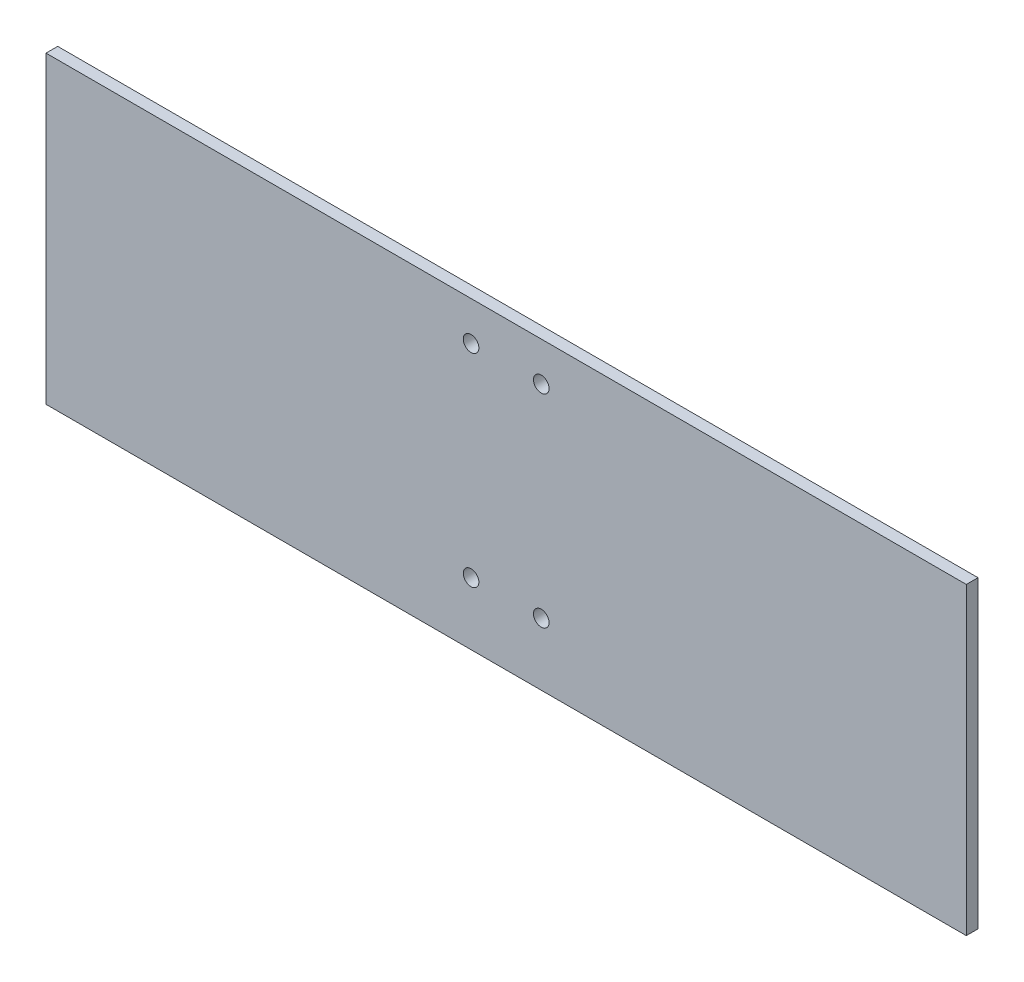
ISO-10303-21;
HEADER;
FILE_DESCRIPTION(('STEP AP214'),'2;1');
FILE_NAME('part.step','',(''),(''),'','','');
FILE_SCHEMA(('AUTOMOTIVE_DESIGN { 1 0 10303 214 1 1 1 1 }'));
ENDSEC;
DATA;
#1=APPLICATION_CONTEXT('core data for automotive mechanical design processes');
#2=APPLICATION_PROTOCOL_DEFINITION('international standard','automotive_design',2000,#1);
#3=PRODUCT_CONTEXT('',#1,'mechanical');
#4=PRODUCT('Part','Part','',(#3));
#5=PRODUCT_RELATED_PRODUCT_CATEGORY('part','',(#4));
#6=PRODUCT_DEFINITION_FORMATION('','',#4);
#7=PRODUCT_DEFINITION_CONTEXT('part definition',#1,'design');
#8=PRODUCT_DEFINITION('design','',#6,#7);
#9=PRODUCT_DEFINITION_SHAPE('','',#8);
#10=(LENGTH_UNIT() NAMED_UNIT(*) SI_UNIT(.MILLI.,.METRE.));
#11=(NAMED_UNIT(*) PLANE_ANGLE_UNIT() SI_UNIT($,.RADIAN.));
#12=(NAMED_UNIT(*) SI_UNIT($,.STERADIAN.) SOLID_ANGLE_UNIT());
#13=UNCERTAINTY_MEASURE_WITH_UNIT(LENGTH_MEASURE(1.E-05),#10,'distance_accuracy_value','');
#14=(GEOMETRIC_REPRESENTATION_CONTEXT(3) GLOBAL_UNCERTAINTY_ASSIGNED_CONTEXT((#13)) GLOBAL_UNIT_ASSIGNED_CONTEXT((#10,
#11,#12)) REPRESENTATION_CONTEXT('',''));
#15=CARTESIAN_POINT('',(0.,0.,0.));
#16=DIRECTION('',(0.,0.,1.));
#17=DIRECTION('',(1.,0.,0.));
#18=AXIS2_PLACEMENT_3D('',#15,#16,#17);
#19=CARTESIAN_POINT('',(-118.,33.,3.));
#20=DIRECTION('',(1.,0.,0.));
#21=DIRECTION('',(0.,1.,0.));
#22=AXIS2_PLACEMENT_3D('',#19,#20,#21);
#23=PLANE('',#22);
#24=DIRECTION('',(0.,-1.,0.));
#25=VECTOR('',#24,1.);
#26=CARTESIAN_POINT('',(-118.,33.,0.));
#27=LINE('',#26,#25);
#28=CARTESIAN_POINT('',(-118.,33.,0.));
#29=VERTEX_POINT('',#28);
#30=CARTESIAN_POINT('',(-118.,-45.,0.));
#31=VERTEX_POINT('',#30);
#32=EDGE_CURVE('E123',#29,#31,#27,.T.);
#33=ORIENTED_EDGE('',*,*,#32,.T.);
#34=DIRECTION('',(0.,0.,1.));
#35=VECTOR('',#34,1.);
#36=CARTESIAN_POINT('',(-118.,-45.,0.));
#37=LINE('',#36,#35);
#38=CARTESIAN_POINT('',(-118.,-45.,3.));
#39=VERTEX_POINT('',#38);
#40=EDGE_CURVE('E93',#31,#39,#37,.T.);
#41=ORIENTED_EDGE('',*,*,#40,.T.);
#42=DIRECTION('',(0.,-1.,0.));
#43=VECTOR('',#42,1.);
#44=CARTESIAN_POINT('',(-118.,33.,3.));
#45=LINE('',#44,#43);
#46=CARTESIAN_POINT('',(-118.,33.,3.));
#47=VERTEX_POINT('',#46);
#48=EDGE_CURVE('E84',#47,#39,#45,.T.);
#49=ORIENTED_EDGE('',*,*,#48,.F.);
#50=DIRECTION('',(0.,0.,-1.));
#51=VECTOR('',#50,1.);
#52=CARTESIAN_POINT('',(-118.,33.,3.));
#53=LINE('',#52,#51);
#54=EDGE_CURVE('E46',#47,#29,#53,.T.);
#55=ORIENTED_EDGE('',*,*,#54,.T.);
#56=EDGE_LOOP('',(#33,#41,#49,#55));
#57=FACE_BOUND('',#56,.T.);
#58=ADVANCED_FACE('F38',(#57),#23,.F.);
#59=CARTESIAN_POINT('',(118.,33.,3.));
#60=DIRECTION('',(-1.,0.,0.));
#61=DIRECTION('',(0.,-1.,0.));
#62=AXIS2_PLACEMENT_3D('',#59,#60,#61);
#63=PLANE('',#62);
#64=DIRECTION('',(0.,1.,0.));
#65=VECTOR('',#64,1.);
#66=CARTESIAN_POINT('',(118.,33.,0.));
#67=LINE('',#66,#65);
#68=CARTESIAN_POINT('',(118.,-45.,0.));
#69=VERTEX_POINT('',#68);
#70=CARTESIAN_POINT('',(118.,33.,0.));
#71=VERTEX_POINT('',#70);
#72=EDGE_CURVE('E65',#69,#71,#67,.T.);
#73=ORIENTED_EDGE('',*,*,#72,.T.);
#74=DIRECTION('',(0.,0.,-1.));
#75=VECTOR('',#74,1.);
#76=CARTESIAN_POINT('',(118.,33.,3.));
#77=LINE('',#76,#75);
#78=CARTESIAN_POINT('',(118.,33.,3.));
#79=VERTEX_POINT('',#78);
#80=EDGE_CURVE('E11',#79,#71,#77,.T.);
#81=ORIENTED_EDGE('',*,*,#80,.F.);
#82=DIRECTION('',(0.,1.,0.));
#83=VECTOR('',#82,1.);
#84=CARTESIAN_POINT('',(118.,33.,3.));
#85=LINE('',#84,#83);
#86=CARTESIAN_POINT('',(118.,-45.,3.));
#87=VERTEX_POINT('',#86);
#88=EDGE_CURVE('E78',#87,#79,#85,.T.);
#89=ORIENTED_EDGE('',*,*,#88,.F.);
#90=DIRECTION('',(0.,0.,1.));
#91=VECTOR('',#90,1.);
#92=CARTESIAN_POINT('',(118.,-45.,0.));
#93=LINE('',#92,#91);
#94=EDGE_CURVE('E81',#69,#87,#93,.T.);
#95=ORIENTED_EDGE('',*,*,#94,.F.);
#96=EDGE_LOOP('',(#73,#81,#89,#95));
#97=FACE_BOUND('',#96,.T.);
#98=ADVANCED_FACE('F80',(#97),#63,.F.);
#99=CARTESIAN_POINT('',(-118.,33.,3.));
#100=DIRECTION('',(0.,-1.,0.));
#101=DIRECTION('',(0.,0.,-1.));
#102=AXIS2_PLACEMENT_3D('',#99,#100,#101);
#103=PLANE('',#102);
#104=DIRECTION('',(-1.,0.,0.));
#105=VECTOR('',#104,1.);
#106=CARTESIAN_POINT('',(-118.,33.,0.));
#107=LINE('',#106,#105);
#108=EDGE_CURVE('E126',#71,#29,#107,.T.);
#109=ORIENTED_EDGE('',*,*,#108,.T.);
#110=ORIENTED_EDGE('',*,*,#54,.F.);
#111=DIRECTION('',(-1.,0.,0.));
#112=VECTOR('',#111,1.);
#113=CARTESIAN_POINT('',(-118.,33.,3.));
#114=LINE('',#113,#112);
#115=EDGE_CURVE('E54',#79,#47,#114,.T.);
#116=ORIENTED_EDGE('',*,*,#115,.F.);
#117=ORIENTED_EDGE('',*,*,#80,.T.);
#118=EDGE_LOOP('',(#109,#110,#116,#117));
#119=FACE_BOUND('',#118,.T.);
#120=ADVANCED_FACE('F136',(#119),#103,.F.);
#121=CARTESIAN_POINT('',(0.,0.,3.));
#122=DIRECTION('',(0.,0.,-1.));
#123=DIRECTION('',(-1.,0.,0.));
#124=AXIS2_PLACEMENT_3D('',#121,#122,#123);
#125=PLANE('',#124);
#126=CARTESIAN_POINT('',(8.99999999999989,23.,3.));
#127=DIRECTION('',(0.,0.,1.));
#128=DIRECTION('',(-1.,0.,0.));
#129=AXIS2_PLACEMENT_3D('',#126,#127,#128);
#130=CIRCLE('',#129,2.);
#131=CARTESIAN_POINT('',(10.9999999999999,23.,3.));
#132=VERTEX_POINT('',#131);
#133=EDGE_CURVE('E115',#132,#132,#130,.T.);
#134=ORIENTED_EDGE('',*,*,#133,.F.);
#135=EDGE_LOOP('',(#134));
#136=FACE_BOUND('',#135,.T.);
#137=CARTESIAN_POINT('',(-9.00000000000006,23.,3.));
#138=DIRECTION('',(0.,0.,1.));
#139=DIRECTION('',(-1.,0.,0.));
#140=AXIS2_PLACEMENT_3D('',#137,#138,#139);
#141=CIRCLE('',#140,2.);
#142=CARTESIAN_POINT('',(-7.00000000000005,23.,3.));
#143=VERTEX_POINT('',#142);
#144=EDGE_CURVE('E109',#143,#143,#141,.T.);
#145=ORIENTED_EDGE('',*,*,#144,.F.);
#146=EDGE_LOOP('',(#145));
#147=FACE_BOUND('',#146,.T.);
#148=CARTESIAN_POINT('',(-9.,-29.,3.));
#149=DIRECTION('',(0.,0.,1.));
#150=DIRECTION('',(1.,0.,0.));
#151=AXIS2_PLACEMENT_3D('',#148,#149,#150);
#152=CIRCLE('',#151,2.);
#153=CARTESIAN_POINT('',(-7.,-29.,3.));
#154=VERTEX_POINT('',#153);
#155=EDGE_CURVE('E102',#154,#154,#152,.T.);
#156=ORIENTED_EDGE('',*,*,#155,.F.);
#157=EDGE_LOOP('',(#156));
#158=FACE_BOUND('',#157,.T.);
#159=CARTESIAN_POINT('',(9.,-29.,3.));
#160=DIRECTION('',(0.,0.,1.));
#161=DIRECTION('',(1.,0.,0.));
#162=AXIS2_PLACEMENT_3D('',#159,#160,#161);
#163=CIRCLE('',#162,2.);
#164=CARTESIAN_POINT('',(11.,-29.,3.));
#165=VERTEX_POINT('',#164);
#166=EDGE_CURVE('E120',#165,#165,#163,.T.);
#167=ORIENTED_EDGE('',*,*,#166,.F.);
#168=EDGE_LOOP('',(#167));
#169=FACE_BOUND('',#168,.T.);
#170=ORIENTED_EDGE('',*,*,#48,.T.);
#171=DIRECTION('',(1.,0.,0.));
#172=VECTOR('',#171,1.);
#173=CARTESIAN_POINT('',(-118.,-45.,3.));
#174=LINE('',#173,#172);
#175=EDGE_CURVE('E90',#39,#87,#174,.T.);
#176=ORIENTED_EDGE('',*,*,#175,.T.);
#177=ORIENTED_EDGE('',*,*,#88,.T.);
#178=ORIENTED_EDGE('',*,*,#115,.T.);
#179=EDGE_LOOP('',(#170,#176,#177,#178));
#180=FACE_BOUND('',#179,.T.);
#181=ADVANCED_FACE('F95',(#136,#147,#158,#169,#180),#125,.F.);
#182=CARTESIAN_POINT('',(0.,0.,0.));
#183=DIRECTION('',(0.,0.,-1.));
#184=DIRECTION('',(-1.,0.,0.));
#185=AXIS2_PLACEMENT_3D('',#182,#183,#184);
#186=PLANE('',#185);
#187=CARTESIAN_POINT('',(8.99999999999989,23.,0.));
#188=DIRECTION('',(0.,0.,-1.));
#189=DIRECTION('',(-1.,0.,0.));
#190=AXIS2_PLACEMENT_3D('',#187,#188,#189);
#191=CIRCLE('',#190,2.);
#192=CARTESIAN_POINT('',(10.9999999999999,23.,0.));
#193=VERTEX_POINT('',#192);
#194=EDGE_CURVE('E92',#193,#193,#191,.F.);
#195=ORIENTED_EDGE('',*,*,#194,.T.);
#196=EDGE_LOOP('',(#195));
#197=FACE_BOUND('',#196,.T.);
#198=CARTESIAN_POINT('',(-9.00000000000006,23.,0.));
#199=DIRECTION('',(0.,0.,-1.));
#200=DIRECTION('',(-1.,0.,0.));
#201=AXIS2_PLACEMENT_3D('',#198,#199,#200);
#202=CIRCLE('',#201,2.);
#203=CARTESIAN_POINT('',(-7.00000000000005,23.,0.));
#204=VERTEX_POINT('',#203);
#205=EDGE_CURVE('E112',#204,#204,#202,.F.);
#206=ORIENTED_EDGE('',*,*,#205,.T.);
#207=EDGE_LOOP('',(#206));
#208=FACE_BOUND('',#207,.T.);
#209=CARTESIAN_POINT('',(-9.,-29.,0.));
#210=DIRECTION('',(0.,0.,-1.));
#211=DIRECTION('',(-1.,0.,0.));
#212=AXIS2_PLACEMENT_3D('',#209,#210,#211);
#213=CIRCLE('',#212,2.);
#214=CARTESIAN_POINT('',(-7.,-29.,0.));
#215=VERTEX_POINT('',#214);
#216=EDGE_CURVE('E106',#215,#215,#213,.F.);
#217=ORIENTED_EDGE('',*,*,#216,.T.);
#218=EDGE_LOOP('',(#217));
#219=FACE_BOUND('',#218,.T.);
#220=CARTESIAN_POINT('',(9.,-29.,0.));
#221=DIRECTION('',(0.,0.,-1.));
#222=DIRECTION('',(-1.,0.,0.));
#223=AXIS2_PLACEMENT_3D('',#220,#221,#222);
#224=CIRCLE('',#223,2.);
#225=CARTESIAN_POINT('',(11.,-29.,0.));
#226=VERTEX_POINT('',#225);
#227=EDGE_CURVE('E105',#226,#226,#224,.F.);
#228=ORIENTED_EDGE('',*,*,#227,.T.);
#229=EDGE_LOOP('',(#228));
#230=FACE_BOUND('',#229,.T.);
#231=ORIENTED_EDGE('',*,*,#32,.F.);
#232=ORIENTED_EDGE('',*,*,#108,.F.);
#233=ORIENTED_EDGE('',*,*,#72,.F.);
#234=DIRECTION('',(1.,0.,0.));
#235=VECTOR('',#234,1.);
#236=CARTESIAN_POINT('',(-118.,-45.,0.));
#237=LINE('',#236,#235);
#238=EDGE_CURVE('E91',#31,#69,#237,.T.);
#239=ORIENTED_EDGE('',*,*,#238,.F.);
#240=EDGE_LOOP('',(#231,#232,#233,#239));
#241=FACE_BOUND('',#240,.T.);
#242=ADVANCED_FACE('F135',(#197,#208,#219,#230,#241),#186,.T.);
#243=CARTESIAN_POINT('',(9.,-29.,-0.00100000000000013));
#244=DIRECTION('',(0.,0.,1.));
#245=DIRECTION('',(1.,0.,0.));
#246=AXIS2_PLACEMENT_3D('',#243,#244,#245);
#247=CYLINDRICAL_SURFACE('',#246,2.);
#248=CARTESIAN_POINT('',(11.,-29.,0.));
#249=CARTESIAN_POINT('',(11.,-29.,0.03125));
#250=CARTESIAN_POINT('',(11.,-29.,0.0625));
#251=CARTESIAN_POINT('',(11.,-29.,0.125));
#252=CARTESIAN_POINT('',(11.,-29.,0.15625));
#253=CARTESIAN_POINT('',(11.,-29.,0.21875));
#254=CARTESIAN_POINT('',(11.,-29.,0.25));
#255=CARTESIAN_POINT('',(11.,-29.,0.3125));
#256=CARTESIAN_POINT('',(11.,-29.,0.34375));
#257=CARTESIAN_POINT('',(11.,-29.,0.40625));
#258=CARTESIAN_POINT('',(11.,-29.,0.4375));
#259=CARTESIAN_POINT('',(11.,-29.,0.5));
#260=CARTESIAN_POINT('',(11.,-29.,0.53125));
#261=CARTESIAN_POINT('',(11.,-29.,0.59375));
#262=CARTESIAN_POINT('',(11.,-29.,0.625));
#263=CARTESIAN_POINT('',(11.,-29.,0.6875));
#264=CARTESIAN_POINT('',(11.,-29.,0.71875));
#265=CARTESIAN_POINT('',(11.,-29.,0.78125));
#266=CARTESIAN_POINT('',(11.,-29.,0.8125));
#267=CARTESIAN_POINT('',(11.,-29.,0.875));
#268=CARTESIAN_POINT('',(11.,-29.,0.90625));
#269=CARTESIAN_POINT('',(11.,-29.,0.96875));
#270=CARTESIAN_POINT('',(11.,-29.,1.));
#271=CARTESIAN_POINT('',(11.,-29.,1.0625));
#272=CARTESIAN_POINT('',(11.,-29.,1.09375));
#273=CARTESIAN_POINT('',(11.,-29.,1.15625));
#274=CARTESIAN_POINT('',(11.,-29.,1.1875));
#275=CARTESIAN_POINT('',(11.,-29.,1.25));
#276=CARTESIAN_POINT('',(11.,-29.,1.28125));
#277=CARTESIAN_POINT('',(11.,-29.,1.34375));
#278=CARTESIAN_POINT('',(11.,-29.,1.375));
#279=CARTESIAN_POINT('',(11.,-29.,1.4375));
#280=CARTESIAN_POINT('',(11.,-29.,1.46875));
#281=CARTESIAN_POINT('',(11.,-29.,1.53125));
#282=CARTESIAN_POINT('',(11.,-29.,1.5625));
#283=CARTESIAN_POINT('',(11.,-29.,1.625));
#284=CARTESIAN_POINT('',(11.,-29.,1.65625));
#285=CARTESIAN_POINT('',(11.,-29.,1.71875));
#286=CARTESIAN_POINT('',(11.,-29.,1.75));
#287=CARTESIAN_POINT('',(11.,-29.,1.8125));
#288=CARTESIAN_POINT('',(11.,-29.,1.84375));
#289=CARTESIAN_POINT('',(11.,-29.,1.90625));
#290=CARTESIAN_POINT('',(11.,-29.,1.9375));
#291=CARTESIAN_POINT('',(11.,-29.,2.));
#292=CARTESIAN_POINT('',(11.,-29.,2.03125));
#293=CARTESIAN_POINT('',(11.,-29.,2.09375));
#294=CARTESIAN_POINT('',(11.,-29.,2.125));
#295=CARTESIAN_POINT('',(11.,-29.,2.1875));
#296=CARTESIAN_POINT('',(11.,-29.,2.21875));
#297=CARTESIAN_POINT('',(11.,-29.,2.28125));
#298=CARTESIAN_POINT('',(11.,-29.,2.3125));
#299=CARTESIAN_POINT('',(11.,-29.,2.375));
#300=CARTESIAN_POINT('',(11.,-29.,2.40625));
#301=CARTESIAN_POINT('',(11.,-29.,2.46875));
#302=CARTESIAN_POINT('',(11.,-29.,2.5));
#303=CARTESIAN_POINT('',(11.,-29.,2.5625));
#304=CARTESIAN_POINT('',(11.,-29.,2.59375));
#305=CARTESIAN_POINT('',(11.,-29.,2.65625));
#306=CARTESIAN_POINT('',(11.,-29.,2.6875));
#307=CARTESIAN_POINT('',(11.,-29.,2.75));
#308=CARTESIAN_POINT('',(11.,-29.,2.78125));
#309=CARTESIAN_POINT('',(11.,-29.,2.84375));
#310=CARTESIAN_POINT('',(11.,-29.,2.875));
#311=CARTESIAN_POINT('',(11.,-29.,2.9375));
#312=CARTESIAN_POINT('',(11.,-29.,2.96875));
#313=CARTESIAN_POINT('',(11.,-29.,3.));
#314=B_SPLINE_CURVE_WITH_KNOTS('',3,(#248,#249,#250,#251,#252,#253,#254,#255,#256,#257,#258,
#259,#260,#261,#262,#263,#264,#265,#266,#267,#268,#269,#270,#271,#272,#273,#274,#275,#276,#277,
#278,#279,#280,#281,#282,#283,#284,#285,#286,#287,#288,#289,#290,#291,#292,#293,#294,#295,#296,
#297,#298,#299,#300,#301,#302,#303,#304,#305,#306,#307,#308,#309,#310,#311,#312,#313),
.UNSPECIFIED.,.F.,.F.,(4,2,2,2,2,2,2,2,2,2,2,2,2,2,2,2,2,2,2,2,2,2,2,2,2,2,2,2,2,2,2,2,4),(0.,
0.09375,0.1875,0.28125,0.375,0.46875,0.5625,0.65625,0.75,0.84375,0.9375,1.03125,1.125,1.21875,
1.3125,1.40625,1.5,1.59375,1.6875,1.78125,1.875,1.96875,2.0625,2.15625,2.25,2.34375,2.4375,
2.53125,2.625,2.71875,2.8125,2.90625,3.),.UNSPECIFIED.);
#315=EDGE_CURVE('BSEAM173',#226,#165,#314,.T.);
#316=ORIENTED_EDGE('',*,*,#227,.F.);
#317=ORIENTED_EDGE('',*,*,#166,.T.);
#318=ORIENTED_EDGE('',*,*,#315,.T.);
#319=ORIENTED_EDGE('',*,*,#315,.F.);
#320=EDGE_LOOP('',(#316,#318,#317,#319));
#321=FACE_BOUND('',#320,.T.);
#322=ADVANCED_FACE('F173',(#321),#247,.F.);
#323=CARTESIAN_POINT('',(-9.,-29.,-0.00100000000000013));
#324=DIRECTION('',(0.,0.,1.));
#325=DIRECTION('',(1.,0.,0.));
#326=AXIS2_PLACEMENT_3D('',#323,#324,#325);
#327=CYLINDRICAL_SURFACE('',#326,2.);
#328=CARTESIAN_POINT('',(-7.,-29.,0.));
#329=CARTESIAN_POINT('',(-7.,-29.,0.03125));
#330=CARTESIAN_POINT('',(-7.,-29.,0.0625));
#331=CARTESIAN_POINT('',(-7.,-29.,0.125));
#332=CARTESIAN_POINT('',(-7.,-29.,0.15625));
#333=CARTESIAN_POINT('',(-7.,-29.,0.21875));
#334=CARTESIAN_POINT('',(-7.,-29.,0.25));
#335=CARTESIAN_POINT('',(-7.,-29.,0.3125));
#336=CARTESIAN_POINT('',(-7.,-29.,0.34375));
#337=CARTESIAN_POINT('',(-7.,-29.,0.40625));
#338=CARTESIAN_POINT('',(-7.,-29.,0.4375));
#339=CARTESIAN_POINT('',(-7.,-29.,0.5));
#340=CARTESIAN_POINT('',(-7.,-29.,0.53125));
#341=CARTESIAN_POINT('',(-7.,-29.,0.59375));
#342=CARTESIAN_POINT('',(-7.,-29.,0.625));
#343=CARTESIAN_POINT('',(-7.,-29.,0.6875));
#344=CARTESIAN_POINT('',(-7.,-29.,0.71875));
#345=CARTESIAN_POINT('',(-7.,-29.,0.78125));
#346=CARTESIAN_POINT('',(-7.,-29.,0.8125));
#347=CARTESIAN_POINT('',(-7.,-29.,0.875));
#348=CARTESIAN_POINT('',(-7.,-29.,0.90625));
#349=CARTESIAN_POINT('',(-7.,-29.,0.96875));
#350=CARTESIAN_POINT('',(-7.,-29.,1.));
#351=CARTESIAN_POINT('',(-7.,-29.,1.0625));
#352=CARTESIAN_POINT('',(-7.,-29.,1.09375));
#353=CARTESIAN_POINT('',(-7.,-29.,1.15625));
#354=CARTESIAN_POINT('',(-7.,-29.,1.1875));
#355=CARTESIAN_POINT('',(-7.,-29.,1.25));
#356=CARTESIAN_POINT('',(-7.,-29.,1.28125));
#357=CARTESIAN_POINT('',(-7.,-29.,1.34375));
#358=CARTESIAN_POINT('',(-7.,-29.,1.375));
#359=CARTESIAN_POINT('',(-7.,-29.,1.4375));
#360=CARTESIAN_POINT('',(-7.,-29.,1.46875));
#361=CARTESIAN_POINT('',(-7.,-29.,1.53125));
#362=CARTESIAN_POINT('',(-7.,-29.,1.5625));
#363=CARTESIAN_POINT('',(-7.,-29.,1.625));
#364=CARTESIAN_POINT('',(-7.,-29.,1.65625));
#365=CARTESIAN_POINT('',(-7.,-29.,1.71875));
#366=CARTESIAN_POINT('',(-7.,-29.,1.75));
#367=CARTESIAN_POINT('',(-7.,-29.,1.8125));
#368=CARTESIAN_POINT('',(-7.,-29.,1.84375));
#369=CARTESIAN_POINT('',(-7.,-29.,1.90625));
#370=CARTESIAN_POINT('',(-7.,-29.,1.9375));
#371=CARTESIAN_POINT('',(-7.,-29.,2.));
#372=CARTESIAN_POINT('',(-7.,-29.,2.03125));
#373=CARTESIAN_POINT('',(-7.,-29.,2.09375));
#374=CARTESIAN_POINT('',(-7.,-29.,2.125));
#375=CARTESIAN_POINT('',(-7.,-29.,2.1875));
#376=CARTESIAN_POINT('',(-7.,-29.,2.21875));
#377=CARTESIAN_POINT('',(-7.,-29.,2.28125));
#378=CARTESIAN_POINT('',(-7.,-29.,2.3125));
#379=CARTESIAN_POINT('',(-7.,-29.,2.375));
#380=CARTESIAN_POINT('',(-7.,-29.,2.40625));
#381=CARTESIAN_POINT('',(-7.,-29.,2.46875));
#382=CARTESIAN_POINT('',(-7.,-29.,2.5));
#383=CARTESIAN_POINT('',(-7.,-29.,2.5625));
#384=CARTESIAN_POINT('',(-7.,-29.,2.59375));
#385=CARTESIAN_POINT('',(-7.,-29.,2.65625));
#386=CARTESIAN_POINT('',(-7.,-29.,2.6875));
#387=CARTESIAN_POINT('',(-7.,-29.,2.75));
#388=CARTESIAN_POINT('',(-7.,-29.,2.78125));
#389=CARTESIAN_POINT('',(-7.,-29.,2.84375));
#390=CARTESIAN_POINT('',(-7.,-29.,2.875));
#391=CARTESIAN_POINT('',(-7.,-29.,2.9375));
#392=CARTESIAN_POINT('',(-7.,-29.,2.96875));
#393=CARTESIAN_POINT('',(-7.,-29.,3.));
#394=B_SPLINE_CURVE_WITH_KNOTS('',3,(#328,#329,#330,#331,#332,#333,#334,#335,#336,#337,#338,
#339,#340,#341,#342,#343,#344,#345,#346,#347,#348,#349,#350,#351,#352,#353,#354,#355,#356,#357,
#358,#359,#360,#361,#362,#363,#364,#365,#366,#367,#368,#369,#370,#371,#372,#373,#374,#375,#376,
#377,#378,#379,#380,#381,#382,#383,#384,#385,#386,#387,#388,#389,#390,#391,#392,#393),
.UNSPECIFIED.,.F.,.F.,(4,2,2,2,2,2,2,2,2,2,2,2,2,2,2,2,2,2,2,2,2,2,2,2,2,2,2,2,2,2,2,2,4),(0.,
0.09375,0.1875,0.28125,0.375,0.46875,0.5625,0.65625,0.75,0.84375,0.9375,1.03125,1.125,1.21875,
1.3125,1.40625,1.5,1.59375,1.6875,1.78125,1.875,1.96875,2.0625,2.15625,2.25,2.34375,2.4375,
2.53125,2.625,2.71875,2.8125,2.90625,3.),.UNSPECIFIED.);
#395=EDGE_CURVE('BSEAM198',#215,#154,#394,.T.);
#396=ORIENTED_EDGE('',*,*,#216,.F.);
#397=ORIENTED_EDGE('',*,*,#155,.T.);
#398=ORIENTED_EDGE('',*,*,#395,.T.);
#399=ORIENTED_EDGE('',*,*,#395,.F.);
#400=EDGE_LOOP('',(#396,#398,#397,#399));
#401=FACE_BOUND('',#400,.T.);
#402=ADVANCED_FACE('F198',(#401),#327,.F.);
#403=CARTESIAN_POINT('',(-9.00000000000006,23.,-0.00100000000000013));
#404=DIRECTION('',(0.,0.,1.));
#405=DIRECTION('',(1.,0.,0.));
#406=AXIS2_PLACEMENT_3D('',#403,#404,#405);
#407=CYLINDRICAL_SURFACE('',#406,2.);
#408=CARTESIAN_POINT('',(-7.00000000000005,23.,0.));
#409=CARTESIAN_POINT('',(-7.00000000000005,23.,0.03125));
#410=CARTESIAN_POINT('',(-7.00000000000005,23.,0.0625));
#411=CARTESIAN_POINT('',(-7.00000000000005,23.,0.125));
#412=CARTESIAN_POINT('',(-7.00000000000005,23.,0.15625));
#413=CARTESIAN_POINT('',(-7.00000000000005,23.,0.21875));
#414=CARTESIAN_POINT('',(-7.00000000000005,23.,0.25));
#415=CARTESIAN_POINT('',(-7.00000000000005,23.,0.3125));
#416=CARTESIAN_POINT('',(-7.00000000000005,23.,0.34375));
#417=CARTESIAN_POINT('',(-7.00000000000005,23.,0.40625));
#418=CARTESIAN_POINT('',(-7.00000000000005,23.,0.4375));
#419=CARTESIAN_POINT('',(-7.00000000000005,23.,0.5));
#420=CARTESIAN_POINT('',(-7.00000000000005,23.,0.53125));
#421=CARTESIAN_POINT('',(-7.00000000000005,23.,0.59375));
#422=CARTESIAN_POINT('',(-7.00000000000005,23.,0.625));
#423=CARTESIAN_POINT('',(-7.00000000000005,23.,0.6875));
#424=CARTESIAN_POINT('',(-7.00000000000005,23.,0.71875));
#425=CARTESIAN_POINT('',(-7.00000000000005,23.,0.78125));
#426=CARTESIAN_POINT('',(-7.00000000000005,23.,0.8125));
#427=CARTESIAN_POINT('',(-7.00000000000005,23.,0.875));
#428=CARTESIAN_POINT('',(-7.00000000000005,23.,0.90625));
#429=CARTESIAN_POINT('',(-7.00000000000005,23.,0.96875));
#430=CARTESIAN_POINT('',(-7.00000000000005,23.,1.));
#431=CARTESIAN_POINT('',(-7.00000000000005,23.,1.0625));
#432=CARTESIAN_POINT('',(-7.00000000000005,23.,1.09375));
#433=CARTESIAN_POINT('',(-7.00000000000005,23.,1.15625));
#434=CARTESIAN_POINT('',(-7.00000000000005,23.,1.1875));
#435=CARTESIAN_POINT('',(-7.00000000000005,23.,1.25));
#436=CARTESIAN_POINT('',(-7.00000000000005,23.,1.28125));
#437=CARTESIAN_POINT('',(-7.00000000000005,23.,1.34375));
#438=CARTESIAN_POINT('',(-7.00000000000005,23.,1.375));
#439=CARTESIAN_POINT('',(-7.00000000000005,23.,1.4375));
#440=CARTESIAN_POINT('',(-7.00000000000005,23.,1.46875));
#441=CARTESIAN_POINT('',(-7.00000000000005,23.,1.53125));
#442=CARTESIAN_POINT('',(-7.00000000000005,23.,1.5625));
#443=CARTESIAN_POINT('',(-7.00000000000005,23.,1.625));
#444=CARTESIAN_POINT('',(-7.00000000000005,23.,1.65625));
#445=CARTESIAN_POINT('',(-7.00000000000005,23.,1.71875));
#446=CARTESIAN_POINT('',(-7.00000000000005,23.,1.75));
#447=CARTESIAN_POINT('',(-7.00000000000005,23.,1.8125));
#448=CARTESIAN_POINT('',(-7.00000000000005,23.,1.84375));
#449=CARTESIAN_POINT('',(-7.00000000000005,23.,1.90625));
#450=CARTESIAN_POINT('',(-7.00000000000005,23.,1.9375));
#451=CARTESIAN_POINT('',(-7.00000000000005,23.,2.));
#452=CARTESIAN_POINT('',(-7.00000000000005,23.,2.03125));
#453=CARTESIAN_POINT('',(-7.00000000000005,23.,2.09375));
#454=CARTESIAN_POINT('',(-7.00000000000005,23.,2.125));
#455=CARTESIAN_POINT('',(-7.00000000000005,23.,2.1875));
#456=CARTESIAN_POINT('',(-7.00000000000005,23.,2.21875));
#457=CARTESIAN_POINT('',(-7.00000000000005,23.,2.28125));
#458=CARTESIAN_POINT('',(-7.00000000000005,23.,2.3125));
#459=CARTESIAN_POINT('',(-7.00000000000005,23.,2.375));
#460=CARTESIAN_POINT('',(-7.00000000000005,23.,2.40625));
#461=CARTESIAN_POINT('',(-7.00000000000005,23.,2.46875));
#462=CARTESIAN_POINT('',(-7.00000000000005,23.,2.5));
#463=CARTESIAN_POINT('',(-7.00000000000005,23.,2.5625));
#464=CARTESIAN_POINT('',(-7.00000000000005,23.,2.59375));
#465=CARTESIAN_POINT('',(-7.00000000000005,23.,2.65625));
#466=CARTESIAN_POINT('',(-7.00000000000005,23.,2.6875));
#467=CARTESIAN_POINT('',(-7.00000000000005,23.,2.75));
#468=CARTESIAN_POINT('',(-7.00000000000005,23.,2.78125));
#469=CARTESIAN_POINT('',(-7.00000000000005,23.,2.84375));
#470=CARTESIAN_POINT('',(-7.00000000000005,23.,2.875));
#471=CARTESIAN_POINT('',(-7.00000000000005,23.,2.9375));
#472=CARTESIAN_POINT('',(-7.00000000000005,23.,2.96875));
#473=CARTESIAN_POINT('',(-7.00000000000005,23.,3.));
#474=B_SPLINE_CURVE_WITH_KNOTS('',3,(#408,#409,#410,#411,#412,#413,#414,#415,#416,#417,#418,
#419,#420,#421,#422,#423,#424,#425,#426,#427,#428,#429,#430,#431,#432,#433,#434,#435,#436,#437,
#438,#439,#440,#441,#442,#443,#444,#445,#446,#447,#448,#449,#450,#451,#452,#453,#454,#455,#456,
#457,#458,#459,#460,#461,#462,#463,#464,#465,#466,#467,#468,#469,#470,#471,#472,#473),
.UNSPECIFIED.,.F.,.F.,(4,2,2,2,2,2,2,2,2,2,2,2,2,2,2,2,2,2,2,2,2,2,2,2,2,2,2,2,2,2,2,2,4),(0.,
0.09375,0.1875,0.28125,0.375,0.46875,0.5625,0.65625,0.75,0.84375,0.9375,1.03125,1.125,1.21875,
1.3125,1.40625,1.5,1.59375,1.6875,1.78125,1.875,1.96875,2.0625,2.15625,2.25,2.34375,2.4375,
2.53125,2.625,2.71875,2.8125,2.90625,3.),.UNSPECIFIED.);
#475=EDGE_CURVE('BSEAM190',#204,#143,#474,.T.);
#476=ORIENTED_EDGE('',*,*,#205,.F.);
#477=ORIENTED_EDGE('',*,*,#144,.T.);
#478=ORIENTED_EDGE('',*,*,#475,.T.);
#479=ORIENTED_EDGE('',*,*,#475,.F.);
#480=EDGE_LOOP('',(#476,#478,#477,#479));
#481=FACE_BOUND('',#480,.T.);
#482=ADVANCED_FACE('F190',(#481),#407,.F.);
#483=CARTESIAN_POINT('',(8.99999999999989,23.,-0.00100000000000013));
#484=DIRECTION('',(0.,0.,1.));
#485=DIRECTION('',(1.,0.,0.));
#486=AXIS2_PLACEMENT_3D('',#483,#484,#485);
#487=CYLINDRICAL_SURFACE('',#486,2.);
#488=CARTESIAN_POINT('',(10.9999999999999,23.,0.));
#489=CARTESIAN_POINT('',(10.9999999999999,23.,0.03125));
#490=CARTESIAN_POINT('',(10.9999999999999,23.,0.0625));
#491=CARTESIAN_POINT('',(10.9999999999999,23.,0.125));
#492=CARTESIAN_POINT('',(10.9999999999999,23.,0.15625));
#493=CARTESIAN_POINT('',(10.9999999999999,23.,0.21875));
#494=CARTESIAN_POINT('',(10.9999999999999,23.,0.25));
#495=CARTESIAN_POINT('',(10.9999999999999,23.,0.3125));
#496=CARTESIAN_POINT('',(10.9999999999999,23.,0.34375));
#497=CARTESIAN_POINT('',(10.9999999999999,23.,0.40625));
#498=CARTESIAN_POINT('',(10.9999999999999,23.,0.4375));
#499=CARTESIAN_POINT('',(10.9999999999999,23.,0.5));
#500=CARTESIAN_POINT('',(10.9999999999999,23.,0.53125));
#501=CARTESIAN_POINT('',(10.9999999999999,23.,0.59375));
#502=CARTESIAN_POINT('',(10.9999999999999,23.,0.625));
#503=CARTESIAN_POINT('',(10.9999999999999,23.,0.6875));
#504=CARTESIAN_POINT('',(10.9999999999999,23.,0.71875));
#505=CARTESIAN_POINT('',(10.9999999999999,23.,0.78125));
#506=CARTESIAN_POINT('',(10.9999999999999,23.,0.8125));
#507=CARTESIAN_POINT('',(10.9999999999999,23.,0.875));
#508=CARTESIAN_POINT('',(10.9999999999999,23.,0.90625));
#509=CARTESIAN_POINT('',(10.9999999999999,23.,0.96875));
#510=CARTESIAN_POINT('',(10.9999999999999,23.,1.));
#511=CARTESIAN_POINT('',(10.9999999999999,23.,1.0625));
#512=CARTESIAN_POINT('',(10.9999999999999,23.,1.09375));
#513=CARTESIAN_POINT('',(10.9999999999999,23.,1.15625));
#514=CARTESIAN_POINT('',(10.9999999999999,23.,1.1875));
#515=CARTESIAN_POINT('',(10.9999999999999,23.,1.25));
#516=CARTESIAN_POINT('',(10.9999999999999,23.,1.28125));
#517=CARTESIAN_POINT('',(10.9999999999999,23.,1.34375));
#518=CARTESIAN_POINT('',(10.9999999999999,23.,1.375));
#519=CARTESIAN_POINT('',(10.9999999999999,23.,1.4375));
#520=CARTESIAN_POINT('',(10.9999999999999,23.,1.46875));
#521=CARTESIAN_POINT('',(10.9999999999999,23.,1.53125));
#522=CARTESIAN_POINT('',(10.9999999999999,23.,1.5625));
#523=CARTESIAN_POINT('',(10.9999999999999,23.,1.625));
#524=CARTESIAN_POINT('',(10.9999999999999,23.,1.65625));
#525=CARTESIAN_POINT('',(10.9999999999999,23.,1.71875));
#526=CARTESIAN_POINT('',(10.9999999999999,23.,1.75));
#527=CARTESIAN_POINT('',(10.9999999999999,23.,1.8125));
#528=CARTESIAN_POINT('',(10.9999999999999,23.,1.84375));
#529=CARTESIAN_POINT('',(10.9999999999999,23.,1.90625));
#530=CARTESIAN_POINT('',(10.9999999999999,23.,1.9375));
#531=CARTESIAN_POINT('',(10.9999999999999,23.,2.));
#532=CARTESIAN_POINT('',(10.9999999999999,23.,2.03125));
#533=CARTESIAN_POINT('',(10.9999999999999,23.,2.09375));
#534=CARTESIAN_POINT('',(10.9999999999999,23.,2.125));
#535=CARTESIAN_POINT('',(10.9999999999999,23.,2.1875));
#536=CARTESIAN_POINT('',(10.9999999999999,23.,2.21875));
#537=CARTESIAN_POINT('',(10.9999999999999,23.,2.28125));
#538=CARTESIAN_POINT('',(10.9999999999999,23.,2.3125));
#539=CARTESIAN_POINT('',(10.9999999999999,23.,2.375));
#540=CARTESIAN_POINT('',(10.9999999999999,23.,2.40625));
#541=CARTESIAN_POINT('',(10.9999999999999,23.,2.46875));
#542=CARTESIAN_POINT('',(10.9999999999999,23.,2.5));
#543=CARTESIAN_POINT('',(10.9999999999999,23.,2.5625));
#544=CARTESIAN_POINT('',(10.9999999999999,23.,2.59375));
#545=CARTESIAN_POINT('',(10.9999999999999,23.,2.65625));
#546=CARTESIAN_POINT('',(10.9999999999999,23.,2.6875));
#547=CARTESIAN_POINT('',(10.9999999999999,23.,2.75));
#548=CARTESIAN_POINT('',(10.9999999999999,23.,2.78125));
#549=CARTESIAN_POINT('',(10.9999999999999,23.,2.84375));
#550=CARTESIAN_POINT('',(10.9999999999999,23.,2.875));
#551=CARTESIAN_POINT('',(10.9999999999999,23.,2.9375));
#552=CARTESIAN_POINT('',(10.9999999999999,23.,2.96875));
#553=CARTESIAN_POINT('',(10.9999999999999,23.,3.));
#554=B_SPLINE_CURVE_WITH_KNOTS('',3,(#488,#489,#490,#491,#492,#493,#494,#495,#496,#497,#498,
#499,#500,#501,#502,#503,#504,#505,#506,#507,#508,#509,#510,#511,#512,#513,#514,#515,#516,#517,
#518,#519,#520,#521,#522,#523,#524,#525,#526,#527,#528,#529,#530,#531,#532,#533,#534,#535,#536,
#537,#538,#539,#540,#541,#542,#543,#544,#545,#546,#547,#548,#549,#550,#551,#552,#553),
.UNSPECIFIED.,.F.,.F.,(4,2,2,2,2,2,2,2,2,2,2,2,2,2,2,2,2,2,2,2,2,2,2,2,2,2,2,2,2,2,2,2,4),(0.,
0.09375,0.1875,0.28125,0.375,0.46875,0.5625,0.65625,0.75,0.84375,0.9375,1.03125,1.125,1.21875,
1.3125,1.40625,1.5,1.59375,1.6875,1.78125,1.875,1.96875,2.0625,2.15625,2.25,2.34375,2.4375,
2.53125,2.625,2.71875,2.8125,2.90625,3.),.UNSPECIFIED.);
#555=EDGE_CURVE('BSEAM182',#193,#132,#554,.T.);
#556=ORIENTED_EDGE('',*,*,#194,.F.);
#557=ORIENTED_EDGE('',*,*,#133,.T.);
#558=ORIENTED_EDGE('',*,*,#555,.T.);
#559=ORIENTED_EDGE('',*,*,#555,.F.);
#560=EDGE_LOOP('',(#556,#558,#557,#559));
#561=FACE_BOUND('',#560,.T.);
#562=ADVANCED_FACE('F182',(#561),#487,.F.);
#563=CARTESIAN_POINT('',(-118.,-45.,0.));
#564=DIRECTION('',(0.,-1.,0.));
#565=DIRECTION('',(0.,0.,-1.));
#566=AXIS2_PLACEMENT_3D('',#563,#564,#565);
#567=PLANE('',#566);
#568=ORIENTED_EDGE('',*,*,#175,.F.);
#569=ORIENTED_EDGE('',*,*,#40,.F.);
#570=ORIENTED_EDGE('',*,*,#238,.T.);
#571=ORIENTED_EDGE('',*,*,#94,.T.);
#572=EDGE_LOOP('',(#568,#569,#570,#571));
#573=FACE_BOUND('',#572,.T.);
#574=ADVANCED_FACE('F88',(#573),#567,.T.);
#575=CLOSED_SHELL('',(#58,#98,#120,#181,#242,#322,#402,#482,#562,#574));
#576=MANIFOLD_SOLID_BREP('B2',#575);
#577=ADVANCED_BREP_SHAPE_REPRESENTATION('',(#18,#576),#14);
#578=SHAPE_DEFINITION_REPRESENTATION(#9,#577);
ENDSEC;
END-ISO-10303-21;
